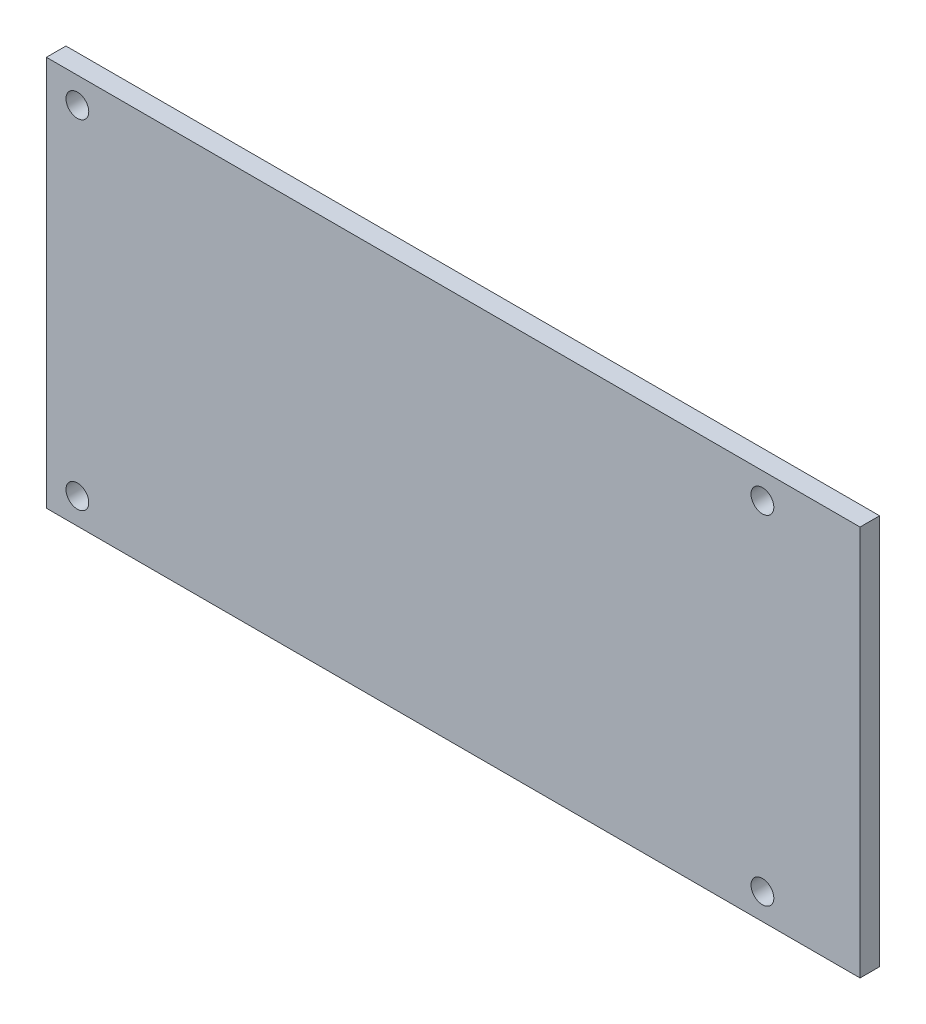
ISO-10303-21;
HEADER;
FILE_DESCRIPTION(('STEP AP214'),'2;1');
FILE_NAME('part.step','',(''),(''),'','','');
FILE_SCHEMA(('AUTOMOTIVE_DESIGN { 1 0 10303 214 1 1 1 1 }'));
ENDSEC;
DATA;
#1=APPLICATION_CONTEXT('core data for automotive mechanical design processes');
#2=APPLICATION_PROTOCOL_DEFINITION('international standard','automotive_design',2000,#1);
#3=PRODUCT_CONTEXT('',#1,'mechanical');
#4=PRODUCT('Part','Part','',(#3));
#5=PRODUCT_RELATED_PRODUCT_CATEGORY('part','',(#4));
#6=PRODUCT_DEFINITION_FORMATION('','',#4);
#7=PRODUCT_DEFINITION_CONTEXT('part definition',#1,'design');
#8=PRODUCT_DEFINITION('design','',#6,#7);
#9=PRODUCT_DEFINITION_SHAPE('','',#8);
#10=(LENGTH_UNIT() NAMED_UNIT(*) SI_UNIT(.MILLI.,.METRE.));
#11=(NAMED_UNIT(*) PLANE_ANGLE_UNIT() SI_UNIT($,.RADIAN.));
#12=(NAMED_UNIT(*) SI_UNIT($,.STERADIAN.) SOLID_ANGLE_UNIT());
#13=UNCERTAINTY_MEASURE_WITH_UNIT(LENGTH_MEASURE(1.E-05),#10,'distance_accuracy_value','');
#14=(GEOMETRIC_REPRESENTATION_CONTEXT(3) GLOBAL_UNCERTAINTY_ASSIGNED_CONTEXT((#13)) GLOBAL_UNIT_ASSIGNED_CONTEXT((#10,
#11,#12)) REPRESENTATION_CONTEXT('',''));
#15=CARTESIAN_POINT('',(0.,0.,0.));
#16=DIRECTION('',(0.,0.,1.));
#17=DIRECTION('',(1.,0.,0.));
#18=AXIS2_PLACEMENT_3D('',#15,#16,#17);
#19=CARTESIAN_POINT('',(0.,0.,3.));
#20=DIRECTION('',(0.,0.,1.));
#21=DIRECTION('',(1.,0.,0.));
#22=AXIS2_PLACEMENT_3D('',#19,#20,#21);
#23=PLANE('',#22);
#24=CARTESIAN_POINT('',(47.5,-26.,3.));
#25=DIRECTION('',(0.,0.,1.));
#26=DIRECTION('',(-1.,0.,0.));
#27=AXIS2_PLACEMENT_3D('',#24,#25,#26);
#28=CIRCLE('',#27,1.75);
#29=CARTESIAN_POINT('',(45.75,-26.,3.));
#30=VERTEX_POINT('',#29);
#31=EDGE_CURVE('E123',#30,#30,#28,.T.);
#32=ORIENTED_EDGE('',*,*,#31,.F.);
#33=EDGE_LOOP('',(#32));
#34=FACE_BOUND('',#33,.T.);
#35=CARTESIAN_POINT('',(47.5,26.,3.));
#36=DIRECTION('',(0.,0.,1.));
#37=DIRECTION('',(1.,0.,0.));
#38=AXIS2_PLACEMENT_3D('',#35,#36,#37);
#39=CIRCLE('',#38,1.75);
#40=CARTESIAN_POINT('',(49.25,26.,3.));
#41=VERTEX_POINT('',#40);
#42=EDGE_CURVE('E102',#41,#41,#39,.T.);
#43=ORIENTED_EDGE('',*,*,#42,.F.);
#44=EDGE_LOOP('',(#43));
#45=FACE_BOUND('',#44,.T.);
#46=DIRECTION('',(0.,1.,0.));
#47=VECTOR('',#46,1.);
#48=CARTESIAN_POINT('',(62.5,30.,3.));
#49=LINE('',#48,#47);
#50=CARTESIAN_POINT('',(62.5,-30.,3.));
#51=VERTEX_POINT('',#50);
#52=CARTESIAN_POINT('',(62.5,30.,3.));
#53=VERTEX_POINT('',#52);
#54=EDGE_CURVE('E87',#51,#53,#49,.T.);
#55=ORIENTED_EDGE('',*,*,#54,.T.);
#56=DIRECTION('',(-1.,0.,0.));
#57=VECTOR('',#56,1.);
#58=CARTESIAN_POINT('',(-62.5,30.,3.));
#59=LINE('',#58,#57);
#60=CARTESIAN_POINT('',(-62.5,30.,3.));
#61=VERTEX_POINT('',#60);
#62=EDGE_CURVE('E82',#53,#61,#59,.T.);
#63=ORIENTED_EDGE('',*,*,#62,.T.);
#64=DIRECTION('',(0.,-1.,0.));
#65=VECTOR('',#64,1.);
#66=CARTESIAN_POINT('',(-62.5,30.,3.));
#67=LINE('',#66,#65);
#68=CARTESIAN_POINT('',(-62.5,-30.,3.));
#69=VERTEX_POINT('',#68);
#70=EDGE_CURVE('E85',#61,#69,#67,.T.);
#71=ORIENTED_EDGE('',*,*,#70,.T.);
#72=DIRECTION('',(1.,0.,0.));
#73=VECTOR('',#72,1.);
#74=CARTESIAN_POINT('',(-62.5,-30.,3.));
#75=LINE('',#74,#73);
#76=EDGE_CURVE('E52',#69,#51,#75,.T.);
#77=ORIENTED_EDGE('',*,*,#76,.T.);
#78=EDGE_LOOP('',(#55,#63,#71,#77));
#79=FACE_BOUND('',#78,.T.);
#80=CARTESIAN_POINT('',(-57.742600500017,26.,3.));
#81=DIRECTION('',(0.,0.,1.));
#82=DIRECTION('',(1.,0.,0.));
#83=AXIS2_PLACEMENT_3D('',#80,#81,#82);
#84=CIRCLE('',#83,1.75);
#85=CARTESIAN_POINT('',(-55.992600500017,26.,3.));
#86=VERTEX_POINT('',#85);
#87=EDGE_CURVE('E117',#86,#86,#84,.T.);
#88=ORIENTED_EDGE('',*,*,#87,.F.);
#89=EDGE_LOOP('',(#88));
#90=FACE_BOUND('',#89,.T.);
#91=CARTESIAN_POINT('',(-57.742600500017,-26.,3.));
#92=DIRECTION('',(0.,0.,1.));
#93=DIRECTION('',(-1.,0.,0.));
#94=AXIS2_PLACEMENT_3D('',#91,#92,#93);
#95=CIRCLE('',#94,1.75);
#96=CARTESIAN_POINT('',(-59.492600500017,-26.,3.));
#97=VERTEX_POINT('',#96);
#98=EDGE_CURVE('E129',#97,#97,#95,.T.);
#99=ORIENTED_EDGE('',*,*,#98,.F.);
#100=EDGE_LOOP('',(#99));
#101=FACE_BOUND('',#100,.T.);
#102=ADVANCED_FACE('F35',(#34,#45,#79,#90,#101),#23,.T.);
#103=CARTESIAN_POINT('',(0.,0.,0.));
#104=DIRECTION('',(0.,0.,1.));
#105=DIRECTION('',(1.,0.,0.));
#106=AXIS2_PLACEMENT_3D('',#103,#104,#105);
#107=PLANE('',#106);
#108=DIRECTION('',(0.,1.,0.));
#109=VECTOR('',#108,1.);
#110=CARTESIAN_POINT('',(62.5,30.,0.));
#111=LINE('',#110,#109);
#112=CARTESIAN_POINT('',(62.5,-30.,0.));
#113=VERTEX_POINT('',#112);
#114=CARTESIAN_POINT('',(62.5,30.,0.));
#115=VERTEX_POINT('',#114);
#116=EDGE_CURVE('E99',#113,#115,#111,.T.);
#117=ORIENTED_EDGE('',*,*,#116,.F.);
#118=DIRECTION('',(1.,0.,0.));
#119=VECTOR('',#118,1.);
#120=CARTESIAN_POINT('',(-62.5,-30.,0.));
#121=LINE('',#120,#119);
#122=CARTESIAN_POINT('',(-62.5,-30.,0.));
#123=VERTEX_POINT('',#122);
#124=EDGE_CURVE('E75',#123,#113,#121,.T.);
#125=ORIENTED_EDGE('',*,*,#124,.F.);
#126=DIRECTION('',(0.,-1.,0.));
#127=VECTOR('',#126,1.);
#128=CARTESIAN_POINT('',(-62.5,30.,0.));
#129=LINE('',#128,#127);
#130=CARTESIAN_POINT('',(-62.5,30.,0.));
#131=VERTEX_POINT('',#130);
#132=EDGE_CURVE('E69',#131,#123,#129,.T.);
#133=ORIENTED_EDGE('',*,*,#132,.F.);
#134=DIRECTION('',(-1.,0.,0.));
#135=VECTOR('',#134,1.);
#136=CARTESIAN_POINT('',(-62.5,30.,0.));
#137=LINE('',#136,#135);
#138=EDGE_CURVE('E91',#115,#131,#137,.T.);
#139=ORIENTED_EDGE('',*,*,#138,.F.);
#140=EDGE_LOOP('',(#117,#125,#133,#139));
#141=FACE_BOUND('',#140,.T.);
#142=CARTESIAN_POINT('',(47.5,26.,0.));
#143=DIRECTION('',(0.,0.,1.));
#144=DIRECTION('',(1.,0.,0.));
#145=AXIS2_PLACEMENT_3D('',#142,#143,#144);
#146=CIRCLE('',#145,1.75);
#147=CARTESIAN_POINT('',(49.25,26.,0.));
#148=VERTEX_POINT('',#147);
#149=EDGE_CURVE('E114',#148,#148,#146,.T.);
#150=ORIENTED_EDGE('',*,*,#149,.T.);
#151=EDGE_LOOP('',(#150));
#152=FACE_BOUND('',#151,.T.);
#153=CARTESIAN_POINT('',(-57.742600500017,26.,0.));
#154=DIRECTION('',(0.,0.,1.));
#155=DIRECTION('',(1.,0.,0.));
#156=AXIS2_PLACEMENT_3D('',#153,#154,#155);
#157=CIRCLE('',#156,1.75);
#158=CARTESIAN_POINT('',(-55.992600500017,26.,0.));
#159=VERTEX_POINT('',#158);
#160=EDGE_CURVE('E120',#159,#159,#157,.T.);
#161=ORIENTED_EDGE('',*,*,#160,.T.);
#162=EDGE_LOOP('',(#161));
#163=FACE_BOUND('',#162,.T.);
#164=CARTESIAN_POINT('',(47.5,-26.,0.));
#165=DIRECTION('',(0.,0.,1.));
#166=DIRECTION('',(-1.,0.,0.));
#167=AXIS2_PLACEMENT_3D('',#164,#165,#166);
#168=CIRCLE('',#167,1.75);
#169=CARTESIAN_POINT('',(45.75,-26.,0.));
#170=VERTEX_POINT('',#169);
#171=EDGE_CURVE('E126',#170,#170,#168,.T.);
#172=ORIENTED_EDGE('',*,*,#171,.T.);
#173=EDGE_LOOP('',(#172));
#174=FACE_BOUND('',#173,.T.);
#175=CARTESIAN_POINT('',(-57.742600500017,-26.,0.));
#176=DIRECTION('',(0.,0.,1.));
#177=DIRECTION('',(-1.,0.,0.));
#178=AXIS2_PLACEMENT_3D('',#175,#176,#177);
#179=CIRCLE('',#178,1.75);
#180=CARTESIAN_POINT('',(-59.492600500017,-26.,0.));
#181=VERTEX_POINT('',#180);
#182=EDGE_CURVE('E132',#181,#181,#179,.T.);
#183=ORIENTED_EDGE('',*,*,#182,.T.);
#184=EDGE_LOOP('',(#183));
#185=FACE_BOUND('',#184,.T.);
#186=ADVANCED_FACE('F110',(#141,#152,#163,#174,#185),#107,.F.);
#187=CARTESIAN_POINT('',(62.5,30.,3.));
#188=DIRECTION('',(-1.,0.,0.));
#189=DIRECTION('',(0.,0.,1.));
#190=AXIS2_PLACEMENT_3D('',#187,#188,#189);
#191=PLANE('',#190);
#192=ORIENTED_EDGE('',*,*,#116,.T.);
#193=DIRECTION('',(0.,0.,-1.));
#194=VECTOR('',#193,1.);
#195=CARTESIAN_POINT('',(62.5,30.,3.));
#196=LINE('',#195,#194);
#197=EDGE_CURVE('E11',#53,#115,#196,.T.);
#198=ORIENTED_EDGE('',*,*,#197,.F.);
#199=ORIENTED_EDGE('',*,*,#54,.F.);
#200=DIRECTION('',(0.,0.,-1.));
#201=VECTOR('',#200,1.);
#202=CARTESIAN_POINT('',(62.5,-30.,3.));
#203=LINE('',#202,#201);
#204=EDGE_CURVE('E95',#51,#113,#203,.T.);
#205=ORIENTED_EDGE('',*,*,#204,.T.);
#206=EDGE_LOOP('',(#192,#198,#199,#205));
#207=FACE_BOUND('',#206,.T.);
#208=ADVANCED_FACE('F37',(#207),#191,.F.);
#209=CARTESIAN_POINT('',(-62.5,30.,3.));
#210=DIRECTION('',(0.,-1.,0.));
#211=DIRECTION('',(1.,0.,0.));
#212=AXIS2_PLACEMENT_3D('',#209,#210,#211);
#213=PLANE('',#212);
#214=ORIENTED_EDGE('',*,*,#138,.T.);
#215=DIRECTION('',(0.,0.,-1.));
#216=VECTOR('',#215,1.);
#217=CARTESIAN_POINT('',(-62.5,30.,3.));
#218=LINE('',#217,#216);
#219=EDGE_CURVE('E44',#61,#131,#218,.T.);
#220=ORIENTED_EDGE('',*,*,#219,.F.);
#221=ORIENTED_EDGE('',*,*,#62,.F.);
#222=ORIENTED_EDGE('',*,*,#197,.T.);
#223=EDGE_LOOP('',(#214,#220,#221,#222));
#224=FACE_BOUND('',#223,.T.);
#225=ADVANCED_FACE('F90',(#224),#213,.F.);
#226=CARTESIAN_POINT('',(-62.5,30.,3.));
#227=DIRECTION('',(1.,0.,0.));
#228=DIRECTION('',(0.,0.,-1.));
#229=AXIS2_PLACEMENT_3D('',#226,#227,#228);
#230=PLANE('',#229);
#231=ORIENTED_EDGE('',*,*,#132,.T.);
#232=DIRECTION('',(0.,0.,-1.));
#233=VECTOR('',#232,1.);
#234=CARTESIAN_POINT('',(-62.5,-30.,3.));
#235=LINE('',#234,#233);
#236=EDGE_CURVE('E92',#69,#123,#235,.T.);
#237=ORIENTED_EDGE('',*,*,#236,.F.);
#238=ORIENTED_EDGE('',*,*,#70,.F.);
#239=ORIENTED_EDGE('',*,*,#219,.T.);
#240=EDGE_LOOP('',(#231,#237,#238,#239));
#241=FACE_BOUND('',#240,.T.);
#242=ADVANCED_FACE('F93',(#241),#230,.F.);
#243=CARTESIAN_POINT('',(-62.5,-30.,3.));
#244=DIRECTION('',(0.,1.,0.));
#245=DIRECTION('',(-1.,0.,0.));
#246=AXIS2_PLACEMENT_3D('',#243,#244,#245);
#247=PLANE('',#246);
#248=ORIENTED_EDGE('',*,*,#124,.T.);
#249=ORIENTED_EDGE('',*,*,#204,.F.);
#250=ORIENTED_EDGE('',*,*,#76,.F.);
#251=ORIENTED_EDGE('',*,*,#236,.T.);
#252=EDGE_LOOP('',(#248,#249,#250,#251));
#253=FACE_BOUND('',#252,.T.);
#254=ADVANCED_FACE('F107',(#253),#247,.F.);
#255=CARTESIAN_POINT('',(47.5,26.,3.));
#256=DIRECTION('',(0.,0.,-1.));
#257=DIRECTION('',(-1.,0.,0.));
#258=AXIS2_PLACEMENT_3D('',#255,#256,#257);
#259=CYLINDRICAL_SURFACE('',#258,1.75);
#260=ORIENTED_EDGE('',*,*,#42,.T.);
#261=EDGE_LOOP('',(#260));
#262=FACE_BOUND('',#261,.T.);
#263=ORIENTED_EDGE('',*,*,#149,.F.);
#264=EDGE_LOOP('',(#263));
#265=FACE_BOUND('',#264,.T.);
#266=ADVANCED_FACE('F151',(#262,#265),#259,.F.);
#267=CARTESIAN_POINT('',(-57.742600500017,26.,3.));
#268=DIRECTION('',(0.,0.,-1.));
#269=DIRECTION('',(-1.,0.,0.));
#270=AXIS2_PLACEMENT_3D('',#267,#268,#269);
#271=CYLINDRICAL_SURFACE('',#270,1.75);
#272=ORIENTED_EDGE('',*,*,#87,.T.);
#273=EDGE_LOOP('',(#272));
#274=FACE_BOUND('',#273,.T.);
#275=ORIENTED_EDGE('',*,*,#160,.F.);
#276=EDGE_LOOP('',(#275));
#277=FACE_BOUND('',#276,.T.);
#278=ADVANCED_FACE('F197',(#274,#277),#271,.F.);
#279=CARTESIAN_POINT('',(47.5,-26.,3.));
#280=DIRECTION('',(0.,0.,-1.));
#281=DIRECTION('',(-1.,0.,0.));
#282=AXIS2_PLACEMENT_3D('',#279,#280,#281);
#283=CYLINDRICAL_SURFACE('',#282,1.75);
#284=ORIENTED_EDGE('',*,*,#31,.T.);
#285=EDGE_LOOP('',(#284));
#286=FACE_BOUND('',#285,.T.);
#287=ORIENTED_EDGE('',*,*,#171,.F.);
#288=EDGE_LOOP('',(#287));
#289=FACE_BOUND('',#288,.T.);
#290=ADVANCED_FACE('F205',(#286,#289),#283,.F.);
#291=CARTESIAN_POINT('',(-57.742600500017,-26.,3.));
#292=DIRECTION('',(0.,0.,-1.));
#293=DIRECTION('',(-1.,0.,0.));
#294=AXIS2_PLACEMENT_3D('',#291,#292,#293);
#295=CYLINDRICAL_SURFACE('',#294,1.75);
#296=ORIENTED_EDGE('',*,*,#98,.T.);
#297=EDGE_LOOP('',(#296));
#298=FACE_BOUND('',#297,.T.);
#299=ORIENTED_EDGE('',*,*,#182,.F.);
#300=EDGE_LOOP('',(#299));
#301=FACE_BOUND('',#300,.T.);
#302=ADVANCED_FACE('F138',(#298,#301),#295,.F.);
#303=CLOSED_SHELL('',(#102,#186,#208,#225,#242,#254,#266,#278,#290,#302));
#304=MANIFOLD_SOLID_BREP('B2',#303);
#305=ADVANCED_BREP_SHAPE_REPRESENTATION('',(#18,#304),#14);
#306=SHAPE_DEFINITION_REPRESENTATION(#9,#305);
ENDSEC;
END-ISO-10303-21;
